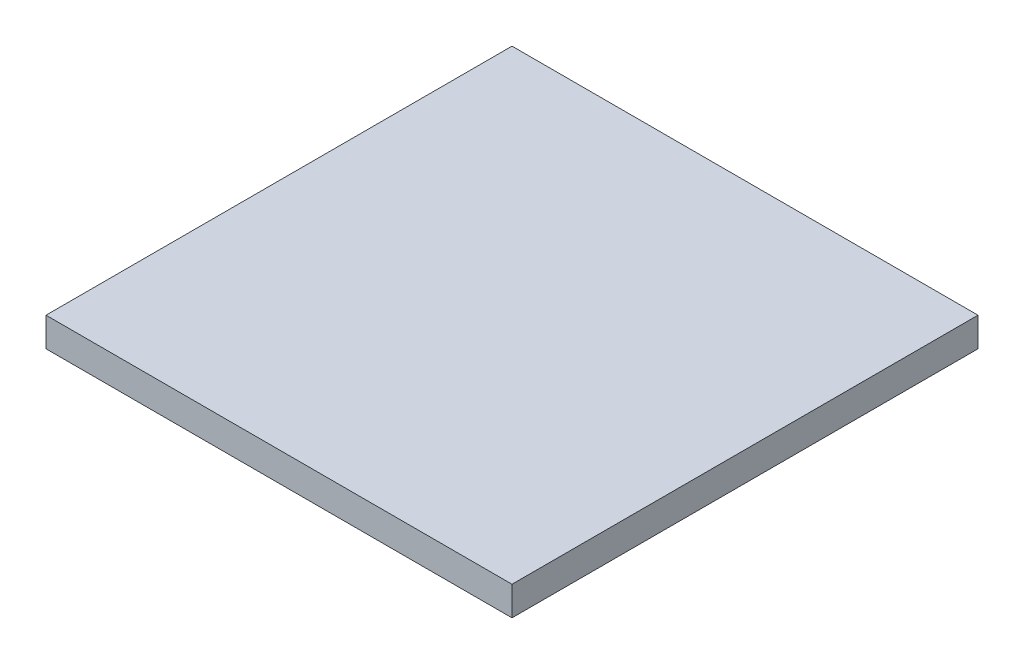
ISO-10303-21;
HEADER;
FILE_DESCRIPTION(('STEP AP214'),'2;1');
FILE_NAME('part.step','',(''),(''),'','','');
FILE_SCHEMA(('AUTOMOTIVE_DESIGN { 1 0 10303 214 1 1 1 1 }'));
ENDSEC;
DATA;
#1=APPLICATION_CONTEXT('core data for automotive mechanical design processes');
#2=APPLICATION_PROTOCOL_DEFINITION('international standard','automotive_design',2000,#1);
#3=PRODUCT_CONTEXT('',#1,'mechanical');
#4=PRODUCT('Part','Part','',(#3));
#5=PRODUCT_RELATED_PRODUCT_CATEGORY('part','',(#4));
#6=PRODUCT_DEFINITION_FORMATION('','',#4);
#7=PRODUCT_DEFINITION_CONTEXT('part definition',#1,'design');
#8=PRODUCT_DEFINITION('design','',#6,#7);
#9=PRODUCT_DEFINITION_SHAPE('','',#8);
#10=(LENGTH_UNIT() NAMED_UNIT(*) SI_UNIT(.MILLI.,.METRE.));
#11=(NAMED_UNIT(*) PLANE_ANGLE_UNIT() SI_UNIT($,.RADIAN.));
#12=(NAMED_UNIT(*) SI_UNIT($,.STERADIAN.) SOLID_ANGLE_UNIT());
#13=UNCERTAINTY_MEASURE_WITH_UNIT(LENGTH_MEASURE(1.E-05),#10,'distance_accuracy_value','');
#14=(GEOMETRIC_REPRESENTATION_CONTEXT(3) GLOBAL_UNCERTAINTY_ASSIGNED_CONTEXT((#13)) GLOBAL_UNIT_ASSIGNED_CONTEXT((#10,
#11,#12)) REPRESENTATION_CONTEXT('',''));
#15=CARTESIAN_POINT('',(0.,0.,0.));
#16=DIRECTION('',(0.,0.,1.));
#17=DIRECTION('',(1.,0.,0.));
#18=AXIS2_PLACEMENT_3D('',#15,#16,#17);
#19=CARTESIAN_POINT('',(0.,10.,0.));
#20=DIRECTION('',(1.,0.,0.));
#21=DIRECTION('',(0.,0.,-1.));
#22=AXIS2_PLACEMENT_3D('',#19,#20,#21);
#23=PLANE('',#22);
#24=DIRECTION('',(0.,0.,1.));
#25=VECTOR('',#24,1.);
#26=CARTESIAN_POINT('',(0.,0.,0.));
#27=LINE('',#26,#25);
#28=CARTESIAN_POINT('',(0.,0.,0.));
#29=VERTEX_POINT('',#28);
#30=CARTESIAN_POINT('',(0.,0.,160.));
#31=VERTEX_POINT('',#30);
#32=EDGE_CURVE('E113',#29,#31,#27,.T.);
#33=ORIENTED_EDGE('',*,*,#32,.T.);
#34=DIRECTION('',(0.,-1.,0.));
#35=VECTOR('',#34,1.);
#36=CARTESIAN_POINT('',(0.,10.,160.));
#37=LINE('',#36,#35);
#38=CARTESIAN_POINT('',(0.,10.,160.));
#39=VERTEX_POINT('',#38);
#40=EDGE_CURVE('E11',#39,#31,#37,.T.);
#41=ORIENTED_EDGE('',*,*,#40,.F.);
#42=DIRECTION('',(0.,0.,1.));
#43=VECTOR('',#42,1.);
#44=CARTESIAN_POINT('',(0.,10.,0.));
#45=LINE('',#44,#43);
#46=CARTESIAN_POINT('',(0.,10.,0.));
#47=VERTEX_POINT('',#46);
#48=EDGE_CURVE('E97',#47,#39,#45,.T.);
#49=ORIENTED_EDGE('',*,*,#48,.F.);
#50=DIRECTION('',(0.,-1.,0.));
#51=VECTOR('',#50,1.);
#52=CARTESIAN_POINT('',(0.,10.,0.));
#53=LINE('',#52,#51);
#54=EDGE_CURVE('E109',#47,#29,#53,.T.);
#55=ORIENTED_EDGE('',*,*,#54,.T.);
#56=EDGE_LOOP('',(#33,#41,#49,#55));
#57=FACE_BOUND('',#56,.T.);
#58=ADVANCED_FACE('F45',(#57),#23,.F.);
#59=CARTESIAN_POINT('',(0.,10.,160.));
#60=DIRECTION('',(0.,0.,-1.));
#61=DIRECTION('',(-1.,0.,0.));
#62=AXIS2_PLACEMENT_3D('',#59,#60,#61);
#63=PLANE('',#62);
#64=DIRECTION('',(1.,0.,0.));
#65=VECTOR('',#64,1.);
#66=CARTESIAN_POINT('',(0.,0.,160.));
#67=LINE('',#66,#65);
#68=CARTESIAN_POINT('',(160.,0.,160.));
#69=VERTEX_POINT('',#68);
#70=EDGE_CURVE('E102',#31,#69,#67,.T.);
#71=ORIENTED_EDGE('',*,*,#70,.T.);
#72=DIRECTION('',(0.,-1.,0.));
#73=VECTOR('',#72,1.);
#74=CARTESIAN_POINT('',(160.,10.,160.));
#75=LINE('',#74,#73);
#76=CARTESIAN_POINT('',(160.,10.,160.));
#77=VERTEX_POINT('',#76);
#78=EDGE_CURVE('E54',#77,#69,#75,.T.);
#79=ORIENTED_EDGE('',*,*,#78,.F.);
#80=DIRECTION('',(1.,0.,0.));
#81=VECTOR('',#80,1.);
#82=CARTESIAN_POINT('',(0.,10.,160.));
#83=LINE('',#82,#81);
#84=EDGE_CURVE('E92',#39,#77,#83,.T.);
#85=ORIENTED_EDGE('',*,*,#84,.F.);
#86=ORIENTED_EDGE('',*,*,#40,.T.);
#87=EDGE_LOOP('',(#71,#79,#85,#86));
#88=FACE_BOUND('',#87,.T.);
#89=ADVANCED_FACE('F101',(#88),#63,.F.);
#90=CARTESIAN_POINT('',(160.,10.,0.));
#91=DIRECTION('',(-1.,0.,0.));
#92=DIRECTION('',(0.,0.,1.));
#93=AXIS2_PLACEMENT_3D('',#90,#91,#92);
#94=PLANE('',#93);
#95=DIRECTION('',(0.,0.,-1.));
#96=VECTOR('',#95,1.);
#97=CARTESIAN_POINT('',(160.,0.,0.));
#98=LINE('',#97,#96);
#99=CARTESIAN_POINT('',(160.,0.,0.));
#100=VERTEX_POINT('',#99);
#101=EDGE_CURVE('E79',#69,#100,#98,.T.);
#102=ORIENTED_EDGE('',*,*,#101,.T.);
#103=DIRECTION('',(0.,-1.,0.));
#104=VECTOR('',#103,1.);
#105=CARTESIAN_POINT('',(160.,10.,0.));
#106=LINE('',#105,#104);
#107=CARTESIAN_POINT('',(160.,10.,0.));
#108=VERTEX_POINT('',#107);
#109=EDGE_CURVE('E104',#108,#100,#106,.T.);
#110=ORIENTED_EDGE('',*,*,#109,.F.);
#111=DIRECTION('',(0.,0.,-1.));
#112=VECTOR('',#111,1.);
#113=CARTESIAN_POINT('',(160.,10.,0.));
#114=LINE('',#113,#112);
#115=EDGE_CURVE('E95',#77,#108,#114,.T.);
#116=ORIENTED_EDGE('',*,*,#115,.F.);
#117=ORIENTED_EDGE('',*,*,#78,.T.);
#118=EDGE_LOOP('',(#102,#110,#116,#117));
#119=FACE_BOUND('',#118,.T.);
#120=ADVANCED_FACE('F105',(#119),#94,.F.);
#121=CARTESIAN_POINT('',(0.,10.,0.));
#122=DIRECTION('',(0.,0.,1.));
#123=DIRECTION('',(1.,0.,0.));
#124=AXIS2_PLACEMENT_3D('',#121,#122,#123);
#125=PLANE('',#124);
#126=DIRECTION('',(-1.,0.,0.));
#127=VECTOR('',#126,1.);
#128=CARTESIAN_POINT('',(0.,0.,0.));
#129=LINE('',#128,#127);
#130=EDGE_CURVE('E85',#100,#29,#129,.T.);
#131=ORIENTED_EDGE('',*,*,#130,.T.);
#132=ORIENTED_EDGE('',*,*,#54,.F.);
#133=DIRECTION('',(-1.,0.,0.));
#134=VECTOR('',#133,1.);
#135=CARTESIAN_POINT('',(0.,10.,0.));
#136=LINE('',#135,#134);
#137=EDGE_CURVE('E62',#108,#47,#136,.T.);
#138=ORIENTED_EDGE('',*,*,#137,.F.);
#139=ORIENTED_EDGE('',*,*,#109,.T.);
#140=EDGE_LOOP('',(#131,#132,#138,#139));
#141=FACE_BOUND('',#140,.T.);
#142=ADVANCED_FACE('F126',(#141),#125,.F.);
#143=CARTESIAN_POINT('',(0.,10.,0.));
#144=DIRECTION('',(0.,1.,0.));
#145=DIRECTION('',(0.,0.,1.));
#146=AXIS2_PLACEMENT_3D('',#143,#144,#145);
#147=PLANE('',#146);
#148=ORIENTED_EDGE('',*,*,#48,.T.);
#149=ORIENTED_EDGE('',*,*,#84,.T.);
#150=ORIENTED_EDGE('',*,*,#115,.T.);
#151=ORIENTED_EDGE('',*,*,#137,.T.);
#152=EDGE_LOOP('',(#148,#149,#150,#151));
#153=FACE_BOUND('',#152,.T.);
#154=ADVANCED_FACE('F93',(#153),#147,.T.);
#155=CARTESIAN_POINT('',(0.,0.,0.));
#156=DIRECTION('',(0.,1.,0.));
#157=DIRECTION('',(0.,0.,1.));
#158=AXIS2_PLACEMENT_3D('',#155,#156,#157);
#159=PLANE('',#158);
#160=ORIENTED_EDGE('',*,*,#32,.F.);
#161=ORIENTED_EDGE('',*,*,#130,.F.);
#162=ORIENTED_EDGE('',*,*,#101,.F.);
#163=ORIENTED_EDGE('',*,*,#70,.F.);
#164=EDGE_LOOP('',(#160,#161,#162,#163));
#165=FACE_BOUND('',#164,.T.);
#166=ADVANCED_FACE('F129',(#165),#159,.F.);
#167=CLOSED_SHELL('',(#58,#89,#120,#142,#154,#166));
#168=MANIFOLD_SOLID_BREP('B2',#167);
#169=ADVANCED_BREP_SHAPE_REPRESENTATION('',(#18,#168),#14);
#170=SHAPE_DEFINITION_REPRESENTATION(#9,#169);
ENDSEC;
END-ISO-10303-21;
